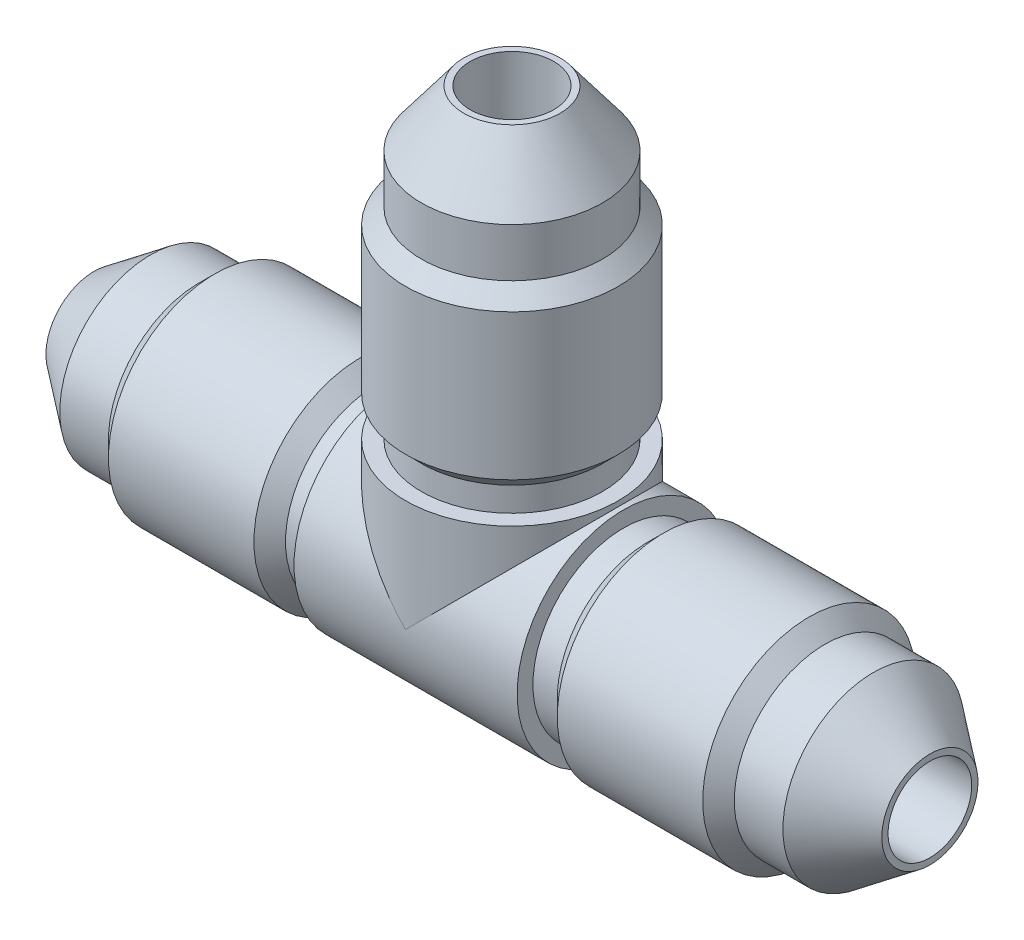
ISO-10303-21;
HEADER;
FILE_DESCRIPTION(('STEP AP214'),'2;1');
FILE_NAME('part.step','',(''),(''),'','','');
FILE_SCHEMA(('AUTOMOTIVE_DESIGN { 1 0 10303 214 1 1 1 1 }'));
ENDSEC;
DATA;
#1=APPLICATION_CONTEXT('core data for automotive mechanical design processes');
#2=APPLICATION_PROTOCOL_DEFINITION('international standard','automotive_design',2000,#1);
#3=PRODUCT_CONTEXT('',#1,'mechanical');
#4=PRODUCT('Part','Part','',(#3));
#5=PRODUCT_RELATED_PRODUCT_CATEGORY('part','',(#4));
#6=PRODUCT_DEFINITION_FORMATION('','',#4);
#7=PRODUCT_DEFINITION_CONTEXT('part definition',#1,'design');
#8=PRODUCT_DEFINITION('design','',#6,#7);
#9=PRODUCT_DEFINITION_SHAPE('','',#8);
#10=(LENGTH_UNIT() NAMED_UNIT(*) SI_UNIT(.MILLI.,.METRE.));
#11=(NAMED_UNIT(*) PLANE_ANGLE_UNIT() SI_UNIT($,.RADIAN.));
#12=(NAMED_UNIT(*) SI_UNIT($,.STERADIAN.) SOLID_ANGLE_UNIT());
#13=UNCERTAINTY_MEASURE_WITH_UNIT(LENGTH_MEASURE(1.E-05),#10,'distance_accuracy_value','');
#14=(GEOMETRIC_REPRESENTATION_CONTEXT(3) GLOBAL_UNCERTAINTY_ASSIGNED_CONTEXT((#13)) GLOBAL_UNIT_ASSIGNED_CONTEXT((#10,
#11,#12)) REPRESENTATION_CONTEXT('',''));
#15=CARTESIAN_POINT('',(0.,0.,0.));
#16=DIRECTION('',(0.,0.,1.));
#17=DIRECTION('',(1.,0.,0.));
#18=AXIS2_PLACEMENT_3D('',#15,#16,#17);
#19=CARTESIAN_POINT('',(0.,0.,0.));
#20=DIRECTION('',(0.,1.,0.));
#21=DIRECTION('',(0.,0.,1.));
#22=AXIS2_PLACEMENT_3D('',#19,#20,#21);
#23=CYLINDRICAL_SURFACE('',#22,5.55625);
#24=CARTESIAN_POINT('',(0.,5.826125,0.));
#25=DIRECTION('',(0.,-1.,0.));
#26=DIRECTION('',(0.,0.,-1.));
#27=AXIS2_PLACEMENT_3D('',#24,#25,#26);
#28=CIRCLE('',#27,5.55625);
#29=CARTESIAN_POINT('',(0.,5.826125,-5.55625));
#30=VERTEX_POINT('',#29);
#31=EDGE_CURVE('E137',#30,#30,#28,.T.);
#32=ORIENTED_EDGE('',*,*,#31,.T.);
#33=EDGE_LOOP('',(#32));
#34=FACE_BOUND('',#33,.T.);
#35=CARTESIAN_POINT('',(0.,0.,0.));
#36=DIRECTION('',(-0.707106781186546,0.707106781186549,0.));
#37=DIRECTION('',(0.707106781186549,0.707106781186546,0.));
#38=AXIS2_PLACEMENT_3D('',#35,#36,#37);
#39=ELLIPSE('',#38,7.85772410593552,5.55625);
#40=CARTESIAN_POINT('',(0.,0.,-5.55625));
#41=VERTEX_POINT('',#40);
#42=CARTESIAN_POINT('',(0.,0.,5.55625));
#43=VERTEX_POINT('',#42);
#44=EDGE_CURVE('E132',#41,#43,#39,.F.);
#45=ORIENTED_EDGE('',*,*,#44,.F.);
#46=CARTESIAN_POINT('',(0.,0.,0.));
#47=DIRECTION('',(0.707106781186549,0.707106781186546,0.));
#48=DIRECTION('',(-0.707106781186546,0.707106781186549,0.));
#49=AXIS2_PLACEMENT_3D('',#46,#47,#48);
#50=ELLIPSE('',#49,7.8577241059355,5.55625);
#51=EDGE_CURVE('E59',#43,#41,#50,.F.);
#52=ORIENTED_EDGE('',*,*,#51,.F.);
#53=EDGE_LOOP('',(#45,#52));
#54=FACE_BOUND('',#53,.T.);
#55=ADVANCED_FACE('F40',(#34,#54),#23,.T.);
#56=CARTESIAN_POINT('',(0.,21.828125,0.));
#57=DIRECTION('',(0.,-1.,0.));
#58=DIRECTION('',(0.,0.,-1.));
#59=AXIS2_PLACEMENT_3D('',#56,#57,#58);
#60=CYLINDRICAL_SURFACE('',#59,2.1844);
#61=CARTESIAN_POINT('',(0.,21.828125,0.));
#62=DIRECTION('',(0.,-1.,0.));
#63=DIRECTION('',(0.,0.,-1.));
#64=AXIS2_PLACEMENT_3D('',#61,#62,#63);
#65=CIRCLE('',#64,2.1844);
#66=CARTESIAN_POINT('',(0.,21.828125,-2.1844));
#67=VERTEX_POINT('',#66);
#68=EDGE_CURVE('E134',#67,#67,#65,.T.);
#69=ORIENTED_EDGE('',*,*,#68,.F.);
#70=EDGE_LOOP('',(#69));
#71=FACE_BOUND('',#70,.T.);
#72=CARTESIAN_POINT('',(0.,0.,0.));
#73=DIRECTION('',(-0.707106781186549,-0.707106781186546,0.));
#74=DIRECTION('',(-0.707106781186546,0.707106781186549,0.));
#75=AXIS2_PLACEMENT_3D('',#72,#73,#74);
#76=ELLIPSE('',#75,3.08920810564778,2.1844);
#77=CARTESIAN_POINT('',(0.,0.,-2.1844));
#78=VERTEX_POINT('',#77);
#79=CARTESIAN_POINT('',(0.,0.,2.1844));
#80=VERTEX_POINT('',#79);
#81=EDGE_CURVE('E48',#78,#80,#76,.F.);
#82=ORIENTED_EDGE('',*,*,#81,.F.);
#83=CARTESIAN_POINT('',(0.,0.,0.));
#84=DIRECTION('',(-0.707106781186546,0.707106781186549,0.));
#85=DIRECTION('',(-0.707106781186549,-0.707106781186546,0.));
#86=AXIS2_PLACEMENT_3D('',#83,#84,#85);
#87=ELLIPSE('',#86,3.08920810564779,2.1844);
#88=EDGE_CURVE('E11',#80,#78,#87,.T.);
#89=ORIENTED_EDGE('',*,*,#88,.F.);
#90=EDGE_LOOP('',(#82,#89));
#91=FACE_BOUND('',#90,.T.);
#92=ADVANCED_FACE('F64',(#71,#91),#60,.F.);
#93=CARTESIAN_POINT('',(0.,5.826125,0.));
#94=DIRECTION('',(0.,1.,0.));
#95=DIRECTION('',(0.,0.,1.));
#96=AXIS2_PLACEMENT_3D('',#93,#94,#95);
#97=CYLINDRICAL_SURFACE('',#96,5.55625);
#98=CARTESIAN_POINT('',(0.,7.92101419710467,0.));
#99=DIRECTION('',(0.,-1.,0.));
#100=DIRECTION('',(0.,0.,-1.));
#101=AXIS2_PLACEMENT_3D('',#98,#99,#100);
#102=CIRCLE('',#101,5.55625);
#103=CARTESIAN_POINT('',(0.,7.92101419710467,-5.55625));
#104=VERTEX_POINT('',#103);
#105=EDGE_CURVE('E140',#104,#104,#102,.T.);
#106=ORIENTED_EDGE('',*,*,#105,.F.);
#107=EDGE_LOOP('',(#106));
#108=FACE_BOUND('',#107,.T.);
#109=CARTESIAN_POINT('',(0.,15.518124164795,0.));
#110=DIRECTION('',(0.,-1.,0.));
#111=DIRECTION('',(0.,0.,-1.));
#112=AXIS2_PLACEMENT_3D('',#109,#110,#111);
#113=CIRCLE('',#112,5.55625);
#114=CARTESIAN_POINT('',(0.,15.518124164795,-5.55625));
#115=VERTEX_POINT('',#114);
#116=EDGE_CURVE('E66',#115,#115,#113,.T.);
#117=ORIENTED_EDGE('',*,*,#116,.T.);
#118=EDGE_LOOP('',(#117));
#119=FACE_BOUND('',#118,.T.);
#120=ADVANCED_FACE('F42',(#108,#119),#97,.T.);
#121=CARTESIAN_POINT('',(0.,16.3430133618997,0.));
#122=DIRECTION('',(0.,-1.,0.));
#123=DIRECTION('',(0.,0.,-1.));
#124=AXIS2_PLACEMENT_3D('',#121,#122,#123);
#125=CONICAL_SURFACE('',#124,4.73136080289533,0.78539816339745);
#126=ORIENTED_EDGE('',*,*,#116,.F.);
#127=EDGE_LOOP('',(#126));
#128=FACE_BOUND('',#127,.T.);
#129=CARTESIAN_POINT('',(0.,16.3430133618997,0.));
#130=DIRECTION('',(0.,-1.,0.));
#131=DIRECTION('',(0.,0.,-1.));
#132=AXIS2_PLACEMENT_3D('',#129,#130,#131);
#133=CIRCLE('',#132,4.73136080289533);
#134=CARTESIAN_POINT('',(0.,16.3430133618997,-4.73136080289533));
#135=VERTEX_POINT('',#134);
#136=EDGE_CURVE('E149',#135,#135,#133,.T.);
#137=ORIENTED_EDGE('',*,*,#136,.T.);
#138=EDGE_LOOP('',(#137));
#139=FACE_BOUND('',#138,.T.);
#140=ADVANCED_FACE('F162',(#128,#139),#125,.T.);
#141=CARTESIAN_POINT('',(0.,21.828125,0.));
#142=DIRECTION('',(0.,-1.,0.));
#143=DIRECTION('',(0.,0.,-1.));
#144=AXIS2_PLACEMENT_3D('',#141,#142,#143);
#145=CONICAL_SURFACE('',#144,2.51206,0.645771823237896);
#146=CARTESIAN_POINT('',(0.,18.8830133618997,0.));
#147=DIRECTION('',(0.,-1.,0.));
#148=DIRECTION('',(0.,0.,-1.));
#149=AXIS2_PLACEMENT_3D('',#146,#147,#148);
#150=CIRCLE('',#149,4.73136080289533);
#151=CARTESIAN_POINT('',(0.,18.8830133618997,-4.73136080289533));
#152=VERTEX_POINT('',#151);
#153=EDGE_CURVE('E152',#152,#152,#150,.T.);
#154=ORIENTED_EDGE('',*,*,#153,.F.);
#155=EDGE_LOOP('',(#154));
#156=FACE_BOUND('',#155,.T.);
#157=CARTESIAN_POINT('',(0.,21.828125,0.));
#158=DIRECTION('',(0.,-1.,0.));
#159=DIRECTION('',(0.,0.,-1.));
#160=AXIS2_PLACEMENT_3D('',#157,#158,#159);
#161=CIRCLE('',#160,2.51206);
#162=CARTESIAN_POINT('',(0.,21.828125,-2.51206));
#163=VERTEX_POINT('',#162);
#164=EDGE_CURVE('E155',#163,#163,#161,.T.);
#165=ORIENTED_EDGE('',*,*,#164,.T.);
#166=EDGE_LOOP('',(#165));
#167=FACE_BOUND('',#166,.T.);
#168=ADVANCED_FACE('F165',(#156,#167),#145,.T.);
#169=CARTESIAN_POINT('',(0.,0.,0.));
#170=DIRECTION('',(0.,-1.,0.));
#171=DIRECTION('',(0.,0.,-1.));
#172=AXIS2_PLACEMENT_3D('',#169,#170,#171);
#173=CYLINDRICAL_SURFACE('',#172,4.73136080289533);
#174=ORIENTED_EDGE('',*,*,#136,.F.);
#175=EDGE_LOOP('',(#174));
#176=FACE_BOUND('',#175,.T.);
#177=ORIENTED_EDGE('',*,*,#153,.T.);
#178=EDGE_LOOP('',(#177));
#179=FACE_BOUND('',#178,.T.);
#180=ADVANCED_FACE('F169',(#176,#179),#173,.T.);
#181=CARTESIAN_POINT('',(0.,21.828125,0.));
#182=DIRECTION('',(0.,-1.,0.));
#183=DIRECTION('',(0.,0.,-1.));
#184=AXIS2_PLACEMENT_3D('',#181,#182,#183);
#185=PLANE('',#184);
#186=ORIENTED_EDGE('',*,*,#68,.T.);
#187=EDGE_LOOP('',(#186));
#188=FACE_BOUND('',#187,.T.);
#189=ORIENTED_EDGE('',*,*,#164,.F.);
#190=EDGE_LOOP('',(#189));
#191=FACE_BOUND('',#190,.T.);
#192=ADVANCED_FACE('F172',(#188,#191),#185,.F.);
#193=CARTESIAN_POINT('',(0.,0.,0.));
#194=DIRECTION('',(0.,-1.,0.));
#195=DIRECTION('',(0.,0.,-1.));
#196=AXIS2_PLACEMENT_3D('',#193,#194,#195);
#197=CYLINDRICAL_SURFACE('',#196,4.73136080289533);
#198=CARTESIAN_POINT('',(0.,5.826125,0.));
#199=DIRECTION('',(0.,-1.,0.));
#200=DIRECTION('',(0.,0.,-1.));
#201=AXIS2_PLACEMENT_3D('',#198,#199,#200);
#202=CIRCLE('',#201,4.73136080289533);
#203=CARTESIAN_POINT('',(0.,5.826125,-4.73136080289533));
#204=VERTEX_POINT('',#203);
#205=EDGE_CURVE('E146',#204,#204,#202,.T.);
#206=ORIENTED_EDGE('',*,*,#205,.F.);
#207=EDGE_LOOP('',(#206));
#208=FACE_BOUND('',#207,.T.);
#209=CARTESIAN_POINT('',(0.,7.096125,0.));
#210=DIRECTION('',(0.,-1.,0.));
#211=DIRECTION('',(0.,0.,-1.));
#212=AXIS2_PLACEMENT_3D('',#209,#210,#211);
#213=CIRCLE('',#212,4.73136080289533);
#214=CARTESIAN_POINT('',(0.,7.096125,-4.73136080289533));
#215=VERTEX_POINT('',#214);
#216=EDGE_CURVE('E143',#215,#215,#213,.T.);
#217=ORIENTED_EDGE('',*,*,#216,.T.);
#218=EDGE_LOOP('',(#217));
#219=FACE_BOUND('',#218,.T.);
#220=ADVANCED_FACE('F182',(#208,#219),#197,.T.);
#221=CARTESIAN_POINT('',(0.,7.92101419710467,0.));
#222=DIRECTION('',(0.,1.,0.));
#223=DIRECTION('',(0.,0.,1.));
#224=AXIS2_PLACEMENT_3D('',#221,#222,#223);
#225=CONICAL_SURFACE('',#224,5.55625,0.78539816339745);
#226=ORIENTED_EDGE('',*,*,#216,.F.);
#227=EDGE_LOOP('',(#226));
#228=FACE_BOUND('',#227,.T.);
#229=ORIENTED_EDGE('',*,*,#105,.T.);
#230=EDGE_LOOP('',(#229));
#231=FACE_BOUND('',#230,.T.);
#232=ADVANCED_FACE('F187',(#228,#231),#225,.T.);
#233=CARTESIAN_POINT('',(0.,5.826125,0.));
#234=DIRECTION('',(0.,-1.,0.));
#235=DIRECTION('',(0.,0.,-1.));
#236=AXIS2_PLACEMENT_3D('',#233,#234,#235);
#237=PLANE('',#236);
#238=ORIENTED_EDGE('',*,*,#31,.F.);
#239=EDGE_LOOP('',(#238));
#240=FACE_BOUND('',#239,.T.);
#241=ORIENTED_EDGE('',*,*,#205,.T.);
#242=EDGE_LOOP('',(#241));
#243=FACE_BOUND('',#242,.T.);
#244=ADVANCED_FACE('F200',(#240,#243),#237,.F.);
#245=CARTESIAN_POINT('',(0.,0.,0.));
#246=DIRECTION('',(-1.,0.,0.));
#247=DIRECTION('',(0.,0.,1.));
#248=AXIS2_PLACEMENT_3D('',#245,#246,#247);
#249=CYLINDRICAL_SURFACE('',#248,5.55625);
#250=CARTESIAN_POINT('',(5.826125,0.,0.));
#251=DIRECTION('',(-1.,0.,0.));
#252=DIRECTION('',(0.,0.,-1.));
#253=AXIS2_PLACEMENT_3D('',#250,#251,#252);
#254=CIRCLE('',#253,5.55625);
#255=CARTESIAN_POINT('',(5.826125,0.,-5.55625));
#256=VERTEX_POINT('',#255);
#257=EDGE_CURVE('E80',#256,#256,#254,.T.);
#258=ORIENTED_EDGE('',*,*,#257,.T.);
#259=EDGE_LOOP('',(#258));
#260=FACE_BOUND('',#259,.T.);
#261=CARTESIAN_POINT('',(-5.826125,0.,0.));
#262=DIRECTION('',(1.,0.,0.));
#263=DIRECTION('',(0.,0.,-1.));
#264=AXIS2_PLACEMENT_3D('',#261,#262,#263);
#265=CIRCLE('',#264,5.55625);
#266=CARTESIAN_POINT('',(-5.826125,0.,-5.55625));
#267=VERTEX_POINT('',#266);
#268=EDGE_CURVE('E107',#267,#267,#265,.T.);
#269=ORIENTED_EDGE('',*,*,#268,.T.);
#270=EDGE_LOOP('',(#269));
#271=FACE_BOUND('',#270,.T.);
#272=ORIENTED_EDGE('',*,*,#51,.T.);
#273=ORIENTED_EDGE('',*,*,#44,.T.);
#274=EDGE_LOOP('',(#272,#273));
#275=FACE_BOUND('',#274,.T.);
#276=ADVANCED_FACE('F206',(#260,#271,#275),#249,.T.);
#277=CARTESIAN_POINT('',(-5.826125,0.,0.));
#278=DIRECTION('',(-1.,0.,0.));
#279=DIRECTION('',(0.,0.,1.));
#280=AXIS2_PLACEMENT_3D('',#277,#278,#279);
#281=CYLINDRICAL_SURFACE('',#280,5.55625);
#282=CARTESIAN_POINT('',(-7.92101419710467,0.,0.));
#283=DIRECTION('',(1.,0.,0.));
#284=DIRECTION('',(0.,0.,-1.));
#285=AXIS2_PLACEMENT_3D('',#282,#283,#284);
#286=CIRCLE('',#285,5.55625);
#287=CARTESIAN_POINT('',(-7.92101419710467,0.,-5.55625));
#288=VERTEX_POINT('',#287);
#289=EDGE_CURVE('E110',#288,#288,#286,.T.);
#290=ORIENTED_EDGE('',*,*,#289,.F.);
#291=EDGE_LOOP('',(#290));
#292=FACE_BOUND('',#291,.T.);
#293=CARTESIAN_POINT('',(-15.518124164795,0.,0.));
#294=DIRECTION('',(1.,0.,0.));
#295=DIRECTION('',(0.,0.,-1.));
#296=AXIS2_PLACEMENT_3D('',#293,#294,#295);
#297=CIRCLE('',#296,5.55625);
#298=CARTESIAN_POINT('',(-15.518124164795,0.,-5.55625));
#299=VERTEX_POINT('',#298);
#300=EDGE_CURVE('E128',#299,#299,#297,.T.);
#301=ORIENTED_EDGE('',*,*,#300,.T.);
#302=EDGE_LOOP('',(#301));
#303=FACE_BOUND('',#302,.T.);
#304=ADVANCED_FACE('F270',(#292,#303),#281,.T.);
#305=CARTESIAN_POINT('',(-16.3430133618997,0.,0.));
#306=DIRECTION('',(1.,0.,0.));
#307=DIRECTION('',(0.,0.,-1.));
#308=AXIS2_PLACEMENT_3D('',#305,#306,#307);
#309=CONICAL_SURFACE('',#308,4.73136080289533,0.78539816339745);
#310=ORIENTED_EDGE('',*,*,#300,.F.);
#311=EDGE_LOOP('',(#310));
#312=FACE_BOUND('',#311,.T.);
#313=CARTESIAN_POINT('',(-16.3430133618997,0.,0.));
#314=DIRECTION('',(1.,0.,0.));
#315=DIRECTION('',(0.,0.,-1.));
#316=AXIS2_PLACEMENT_3D('',#313,#314,#315);
#317=CIRCLE('',#316,4.73136080289533);
#318=CARTESIAN_POINT('',(-16.3430133618997,0.,-4.73136080289533));
#319=VERTEX_POINT('',#318);
#320=EDGE_CURVE('E119',#319,#319,#317,.T.);
#321=ORIENTED_EDGE('',*,*,#320,.T.);
#322=EDGE_LOOP('',(#321));
#323=FACE_BOUND('',#322,.T.);
#324=ADVANCED_FACE('F282',(#312,#323),#309,.T.);
#325=CARTESIAN_POINT('',(-21.828125,0.,0.));
#326=DIRECTION('',(1.,0.,0.));
#327=DIRECTION('',(0.,0.,-1.));
#328=AXIS2_PLACEMENT_3D('',#325,#326,#327);
#329=CONICAL_SURFACE('',#328,2.51206,0.645771823237896);
#330=CARTESIAN_POINT('',(-18.8830133618997,0.,0.));
#331=DIRECTION('',(1.,0.,0.));
#332=DIRECTION('',(0.,0.,-1.));
#333=AXIS2_PLACEMENT_3D('',#330,#331,#332);
#334=CIRCLE('',#333,4.73136080289533);
#335=CARTESIAN_POINT('',(-18.8830133618997,0.,-4.73136080289533));
#336=VERTEX_POINT('',#335);
#337=EDGE_CURVE('E122',#336,#336,#334,.T.);
#338=ORIENTED_EDGE('',*,*,#337,.F.);
#339=EDGE_LOOP('',(#338));
#340=FACE_BOUND('',#339,.T.);
#341=CARTESIAN_POINT('',(-21.828125,0.,0.));
#342=DIRECTION('',(1.,0.,0.));
#343=DIRECTION('',(0.,0.,-1.));
#344=AXIS2_PLACEMENT_3D('',#341,#342,#343);
#345=CIRCLE('',#344,2.51206);
#346=CARTESIAN_POINT('',(-21.828125,0.,-2.51206));
#347=VERTEX_POINT('',#346);
#348=EDGE_CURVE('E125',#347,#347,#345,.T.);
#349=ORIENTED_EDGE('',*,*,#348,.T.);
#350=EDGE_LOOP('',(#349));
#351=FACE_BOUND('',#350,.T.);
#352=ADVANCED_FACE('F292',(#340,#351),#329,.T.);
#353=CARTESIAN_POINT('',(0.,0.,0.));
#354=DIRECTION('',(1.,0.,0.));
#355=DIRECTION('',(0.,0.,-1.));
#356=AXIS2_PLACEMENT_3D('',#353,#354,#355);
#357=CYLINDRICAL_SURFACE('',#356,4.73136080289533);
#358=ORIENTED_EDGE('',*,*,#320,.F.);
#359=EDGE_LOOP('',(#358));
#360=FACE_BOUND('',#359,.T.);
#361=ORIENTED_EDGE('',*,*,#337,.T.);
#362=EDGE_LOOP('',(#361));
#363=FACE_BOUND('',#362,.T.);
#364=ADVANCED_FACE('F302',(#360,#363),#357,.T.);
#365=CARTESIAN_POINT('',(-21.828125,0.,0.));
#366=DIRECTION('',(1.,0.,0.));
#367=DIRECTION('',(0.,0.,-1.));
#368=AXIS2_PLACEMENT_3D('',#365,#366,#367);
#369=PLANE('',#368);
#370=CARTESIAN_POINT('',(-21.828125,0.,0.));
#371=DIRECTION('',(1.,0.,0.));
#372=DIRECTION('',(0.,0.,-1.));
#373=AXIS2_PLACEMENT_3D('',#370,#371,#372);
#374=CIRCLE('',#373,2.1844);
#375=CARTESIAN_POINT('',(-21.828125,0.,-2.1844));
#376=VERTEX_POINT('',#375);
#377=EDGE_CURVE('E75',#376,#376,#374,.T.);
#378=ORIENTED_EDGE('',*,*,#377,.T.);
#379=EDGE_LOOP('',(#378));
#380=FACE_BOUND('',#379,.T.);
#381=ORIENTED_EDGE('',*,*,#348,.F.);
#382=EDGE_LOOP('',(#381));
#383=FACE_BOUND('',#382,.T.);
#384=ADVANCED_FACE('F312',(#380,#383),#369,.F.);
#385=CARTESIAN_POINT('',(0.,0.,0.));
#386=DIRECTION('',(1.,0.,0.));
#387=DIRECTION('',(0.,0.,-1.));
#388=AXIS2_PLACEMENT_3D('',#385,#386,#387);
#389=CYLINDRICAL_SURFACE('',#388,4.73136080289533);
#390=CARTESIAN_POINT('',(-5.826125,0.,0.));
#391=DIRECTION('',(1.,0.,0.));
#392=DIRECTION('',(0.,0.,-1.));
#393=AXIS2_PLACEMENT_3D('',#390,#391,#392);
#394=CIRCLE('',#393,4.73136080289533);
#395=CARTESIAN_POINT('',(-5.826125,0.,-4.73136080289533));
#396=VERTEX_POINT('',#395);
#397=EDGE_CURVE('E116',#396,#396,#394,.T.);
#398=ORIENTED_EDGE('',*,*,#397,.F.);
#399=EDGE_LOOP('',(#398));
#400=FACE_BOUND('',#399,.T.);
#401=CARTESIAN_POINT('',(-7.096125,0.,0.));
#402=DIRECTION('',(1.,0.,0.));
#403=DIRECTION('',(0.,0.,-1.));
#404=AXIS2_PLACEMENT_3D('',#401,#402,#403);
#405=CIRCLE('',#404,4.73136080289533);
#406=CARTESIAN_POINT('',(-7.096125,0.,-4.73136080289533));
#407=VERTEX_POINT('',#406);
#408=EDGE_CURVE('E113',#407,#407,#405,.T.);
#409=ORIENTED_EDGE('',*,*,#408,.T.);
#410=EDGE_LOOP('',(#409));
#411=FACE_BOUND('',#410,.T.);
#412=ADVANCED_FACE('F322',(#400,#411),#389,.T.);
#413=CARTESIAN_POINT('',(-7.92101419710467,0.,0.));
#414=DIRECTION('',(-1.,0.,0.));
#415=DIRECTION('',(0.,0.,1.));
#416=AXIS2_PLACEMENT_3D('',#413,#414,#415);
#417=CONICAL_SURFACE('',#416,5.55625,0.78539816339745);
#418=ORIENTED_EDGE('',*,*,#408,.F.);
#419=EDGE_LOOP('',(#418));
#420=FACE_BOUND('',#419,.T.);
#421=ORIENTED_EDGE('',*,*,#289,.T.);
#422=EDGE_LOOP('',(#421));
#423=FACE_BOUND('',#422,.T.);
#424=ADVANCED_FACE('F332',(#420,#423),#417,.T.);
#425=CARTESIAN_POINT('',(-5.826125,0.,0.));
#426=DIRECTION('',(1.,0.,0.));
#427=DIRECTION('',(0.,0.,-1.));
#428=AXIS2_PLACEMENT_3D('',#425,#426,#427);
#429=PLANE('',#428);
#430=ORIENTED_EDGE('',*,*,#268,.F.);
#431=EDGE_LOOP('',(#430));
#432=FACE_BOUND('',#431,.T.);
#433=ORIENTED_EDGE('',*,*,#397,.T.);
#434=EDGE_LOOP('',(#433));
#435=FACE_BOUND('',#434,.T.);
#436=ADVANCED_FACE('F342',(#432,#435),#429,.F.);
#437=CARTESIAN_POINT('',(5.826125,0.,0.));
#438=DIRECTION('',(1.,0.,0.));
#439=DIRECTION('',(0.,0.,1.));
#440=AXIS2_PLACEMENT_3D('',#437,#438,#439);
#441=CYLINDRICAL_SURFACE('',#440,5.55625);
#442=CARTESIAN_POINT('',(7.92101419710467,0.,0.));
#443=DIRECTION('',(-1.,0.,0.));
#444=DIRECTION('',(0.,0.,-1.));
#445=AXIS2_PLACEMENT_3D('',#442,#443,#444);
#446=CIRCLE('',#445,5.55625);
#447=CARTESIAN_POINT('',(7.92101419710467,0.,-5.55625));
#448=VERTEX_POINT('',#447);
#449=EDGE_CURVE('E83',#448,#448,#446,.T.);
#450=ORIENTED_EDGE('',*,*,#449,.F.);
#451=EDGE_LOOP('',(#450));
#452=FACE_BOUND('',#451,.T.);
#453=CARTESIAN_POINT('',(15.518124164795,-1.08362481870465E-13,0.));
#454=DIRECTION('',(-1.,0.,0.));
#455=DIRECTION('',(0.,0.,-1.));
#456=AXIS2_PLACEMENT_3D('',#453,#454,#455);
#457=CIRCLE('',#456,5.55625);
#458=CARTESIAN_POINT('',(15.518124164795,-1.08362481870465E-13,-5.55625));
#459=VERTEX_POINT('',#458);
#460=EDGE_CURVE('E103',#459,#459,#457,.T.);
#461=ORIENTED_EDGE('',*,*,#460,.T.);
#462=EDGE_LOOP('',(#461));
#463=FACE_BOUND('',#462,.T.);
#464=ADVANCED_FACE('F352',(#452,#463),#441,.T.);
#465=CARTESIAN_POINT('',(16.3430133618997,-1.14122652347074E-13,0.));
#466=DIRECTION('',(-1.,0.,0.));
#467=DIRECTION('',(0.,0.,-1.));
#468=AXIS2_PLACEMENT_3D('',#465,#466,#467);
#469=CONICAL_SURFACE('',#468,4.73136080289533,0.78539816339745);
#470=ORIENTED_EDGE('',*,*,#460,.F.);
#471=EDGE_LOOP('',(#470));
#472=FACE_BOUND('',#471,.T.);
#473=CARTESIAN_POINT('',(16.3430133618997,-1.14122652347074E-13,0.));
#474=DIRECTION('',(-1.,0.,0.));
#475=DIRECTION('',(0.,0.,-1.));
#476=AXIS2_PLACEMENT_3D('',#473,#474,#475);
#477=CIRCLE('',#476,4.73136080289533);
#478=CARTESIAN_POINT('',(16.3430133618997,-1.14122652347074E-13,-4.73136080289533));
#479=VERTEX_POINT('',#478);
#480=EDGE_CURVE('E94',#479,#479,#477,.T.);
#481=ORIENTED_EDGE('',*,*,#480,.T.);
#482=EDGE_LOOP('',(#481));
#483=FACE_BOUND('',#482,.T.);
#484=ADVANCED_FACE('F362',(#472,#483),#469,.T.);
#485=CARTESIAN_POINT('',(21.828125,-1.52424982198871E-13,0.));
#486=DIRECTION('',(-1.,0.,0.));
#487=DIRECTION('',(0.,0.,-1.));
#488=AXIS2_PLACEMENT_3D('',#485,#486,#487);
#489=CONICAL_SURFACE('',#488,2.51206,0.645771823237896);
#490=CARTESIAN_POINT('',(18.8830133618997,-1.31859377548397E-13,0.));
#491=DIRECTION('',(-1.,0.,0.));
#492=DIRECTION('',(0.,0.,-1.));
#493=AXIS2_PLACEMENT_3D('',#490,#491,#492);
#494=CIRCLE('',#493,4.73136080289533);
#495=CARTESIAN_POINT('',(18.8830133618997,-1.31859377548397E-13,-4.73136080289533));
#496=VERTEX_POINT('',#495);
#497=EDGE_CURVE('E97',#496,#496,#494,.T.);
#498=ORIENTED_EDGE('',*,*,#497,.F.);
#499=EDGE_LOOP('',(#498));
#500=FACE_BOUND('',#499,.T.);
#501=CARTESIAN_POINT('',(21.828125,-1.52424982198871E-13,0.));
#502=DIRECTION('',(-1.,0.,0.));
#503=DIRECTION('',(0.,0.,-1.));
#504=AXIS2_PLACEMENT_3D('',#501,#502,#503);
#505=CIRCLE('',#504,2.51206);
#506=CARTESIAN_POINT('',(21.828125,-1.52424982198871E-13,-2.51206));
#507=VERTEX_POINT('',#506);
#508=EDGE_CURVE('E100',#507,#507,#505,.T.);
#509=ORIENTED_EDGE('',*,*,#508,.T.);
#510=EDGE_LOOP('',(#509));
#511=FACE_BOUND('',#510,.T.);
#512=ADVANCED_FACE('F373',(#500,#511),#489,.T.);
#513=CARTESIAN_POINT('',(0.,0.,0.));
#514=DIRECTION('',(-1.,0.,0.));
#515=DIRECTION('',(0.,0.,-1.));
#516=AXIS2_PLACEMENT_3D('',#513,#514,#515);
#517=CYLINDRICAL_SURFACE('',#516,4.73136080289533);
#518=ORIENTED_EDGE('',*,*,#480,.F.);
#519=EDGE_LOOP('',(#518));
#520=FACE_BOUND('',#519,.T.);
#521=ORIENTED_EDGE('',*,*,#497,.T.);
#522=EDGE_LOOP('',(#521));
#523=FACE_BOUND('',#522,.T.);
#524=ADVANCED_FACE('F383',(#520,#523),#517,.T.);
#525=CARTESIAN_POINT('',(21.828125,-1.52424982198871E-13,0.));
#526=DIRECTION('',(-1.,0.,0.));
#527=DIRECTION('',(0.,0.,-1.));
#528=AXIS2_PLACEMENT_3D('',#525,#526,#527);
#529=PLANE('',#528);
#530=CARTESIAN_POINT('',(21.828125,-1.52424982198871E-13,0.));
#531=DIRECTION('',(-1.,0.,0.));
#532=DIRECTION('',(0.,0.,-1.));
#533=AXIS2_PLACEMENT_3D('',#530,#531,#532);
#534=CIRCLE('',#533,2.1844);
#535=CARTESIAN_POINT('',(21.828125,-1.52424982198871E-13,-2.1844));
#536=VERTEX_POINT('',#535);
#537=EDGE_CURVE('E78',#536,#536,#534,.T.);
#538=ORIENTED_EDGE('',*,*,#537,.T.);
#539=EDGE_LOOP('',(#538));
#540=FACE_BOUND('',#539,.T.);
#541=ORIENTED_EDGE('',*,*,#508,.F.);
#542=EDGE_LOOP('',(#541));
#543=FACE_BOUND('',#542,.T.);
#544=ADVANCED_FACE('F393',(#540,#543),#529,.F.);
#545=CARTESIAN_POINT('',(0.,0.,0.));
#546=DIRECTION('',(-1.,0.,0.));
#547=DIRECTION('',(0.,0.,-1.));
#548=AXIS2_PLACEMENT_3D('',#545,#546,#547);
#549=CYLINDRICAL_SURFACE('',#548,4.73136080289533);
#550=CARTESIAN_POINT('',(5.826125,0.,0.));
#551=DIRECTION('',(-1.,0.,0.));
#552=DIRECTION('',(0.,0.,-1.));
#553=AXIS2_PLACEMENT_3D('',#550,#551,#552);
#554=CIRCLE('',#553,4.73136080289533);
#555=CARTESIAN_POINT('',(5.826125,0.,-4.73136080289533));
#556=VERTEX_POINT('',#555);
#557=EDGE_CURVE('E91',#556,#556,#554,.T.);
#558=ORIENTED_EDGE('',*,*,#557,.F.);
#559=EDGE_LOOP('',(#558));
#560=FACE_BOUND('',#559,.T.);
#561=CARTESIAN_POINT('',(7.096125,0.,0.));
#562=DIRECTION('',(-1.,0.,0.));
#563=DIRECTION('',(0.,0.,-1.));
#564=AXIS2_PLACEMENT_3D('',#561,#562,#563);
#565=CIRCLE('',#564,4.73136080289533);
#566=CARTESIAN_POINT('',(7.096125,0.,-4.73136080289533));
#567=VERTEX_POINT('',#566);
#568=EDGE_CURVE('E88',#567,#567,#565,.T.);
#569=ORIENTED_EDGE('',*,*,#568,.T.);
#570=EDGE_LOOP('',(#569));
#571=FACE_BOUND('',#570,.T.);
#572=ADVANCED_FACE('F403',(#560,#571),#549,.T.);
#573=CARTESIAN_POINT('',(7.92101419710467,0.,0.));
#574=DIRECTION('',(1.,0.,0.));
#575=DIRECTION('',(0.,0.,1.));
#576=AXIS2_PLACEMENT_3D('',#573,#574,#575);
#577=CONICAL_SURFACE('',#576,5.55625,0.78539816339745);
#578=ORIENTED_EDGE('',*,*,#568,.F.);
#579=EDGE_LOOP('',(#578));
#580=FACE_BOUND('',#579,.T.);
#581=ORIENTED_EDGE('',*,*,#449,.T.);
#582=EDGE_LOOP('',(#581));
#583=FACE_BOUND('',#582,.T.);
#584=ADVANCED_FACE('F412',(#580,#583),#577,.T.);
#585=CARTESIAN_POINT('',(5.826125,0.,0.));
#586=DIRECTION('',(-1.,0.,0.));
#587=DIRECTION('',(0.,0.,-1.));
#588=AXIS2_PLACEMENT_3D('',#585,#586,#587);
#589=PLANE('',#588);
#590=ORIENTED_EDGE('',*,*,#257,.F.);
#591=EDGE_LOOP('',(#590));
#592=FACE_BOUND('',#591,.T.);
#593=ORIENTED_EDGE('',*,*,#557,.T.);
#594=EDGE_LOOP('',(#593));
#595=FACE_BOUND('',#594,.T.);
#596=ADVANCED_FACE('F70',(#592,#595),#589,.F.);
#597=CARTESIAN_POINT('',(21.828125,0.,0.));
#598=DIRECTION('',(-1.,0.,0.));
#599=DIRECTION('',(0.,0.,1.));
#600=AXIS2_PLACEMENT_3D('',#597,#598,#599);
#601=CYLINDRICAL_SURFACE('',#600,2.1844);
#602=ORIENTED_EDGE('',*,*,#81,.T.);
#603=ORIENTED_EDGE('',*,*,#88,.T.);
#604=EDGE_LOOP('',(#602,#603));
#605=FACE_BOUND('',#604,.T.);
#606=ORIENTED_EDGE('',*,*,#377,.F.);
#607=EDGE_LOOP('',(#606));
#608=FACE_BOUND('',#607,.T.);
#609=ORIENTED_EDGE('',*,*,#537,.F.);
#610=EDGE_LOOP('',(#609));
#611=FACE_BOUND('',#610,.T.);
#612=ADVANCED_FACE('F67',(#605,#608,#611),#601,.F.);
#613=CLOSED_SHELL('',(#55,#92,#120,#140,#168,#180,#192,#220,#232,#244,#276,#304,#324,#352,#364,
#384,#412,#424,#436,#464,#484,#512,#524,#544,#572,#584,#596,#612));
#614=MANIFOLD_SOLID_BREP('B2',#613);
#615=ADVANCED_BREP_SHAPE_REPRESENTATION('',(#18,#614),#14);
#616=SHAPE_DEFINITION_REPRESENTATION(#9,#615);
ENDSEC;
END-ISO-10303-21;
